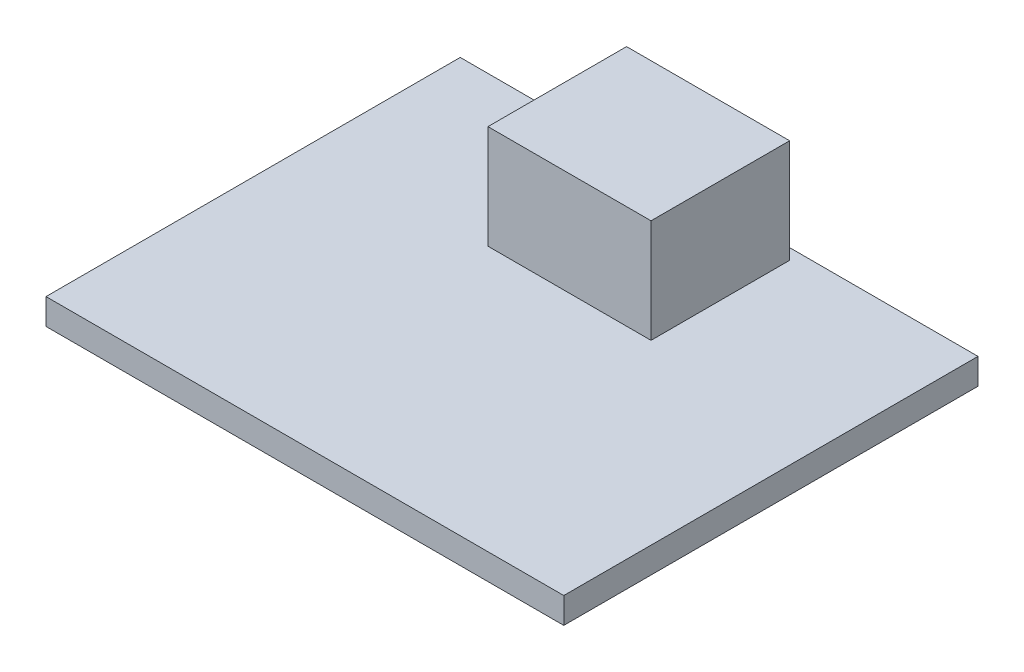
ISO-10303-21;
HEADER;
FILE_DESCRIPTION(('STEP AP214'),'2;1');
FILE_NAME('part.step','',(''),(''),'','','');
FILE_SCHEMA(('AUTOMOTIVE_DESIGN { 1 0 10303 214 1 1 1 1 }'));
ENDSEC;
DATA;
#1=APPLICATION_CONTEXT('core data for automotive mechanical design processes');
#2=APPLICATION_PROTOCOL_DEFINITION('international standard','automotive_design',2000,#1);
#3=PRODUCT_CONTEXT('',#1,'mechanical');
#4=PRODUCT('Part','Part','',(#3));
#5=PRODUCT_RELATED_PRODUCT_CATEGORY('part','',(#4));
#6=PRODUCT_DEFINITION_FORMATION('','',#4);
#7=PRODUCT_DEFINITION_CONTEXT('part definition',#1,'design');
#8=PRODUCT_DEFINITION('design','',#6,#7);
#9=PRODUCT_DEFINITION_SHAPE('','',#8);
#10=(LENGTH_UNIT() NAMED_UNIT(*) SI_UNIT(.MILLI.,.METRE.));
#11=(NAMED_UNIT(*) PLANE_ANGLE_UNIT() SI_UNIT($,.RADIAN.));
#12=(NAMED_UNIT(*) SI_UNIT($,.STERADIAN.) SOLID_ANGLE_UNIT());
#13=UNCERTAINTY_MEASURE_WITH_UNIT(LENGTH_MEASURE(1.E-05),#10,'distance_accuracy_value','');
#14=(GEOMETRIC_REPRESENTATION_CONTEXT(3) GLOBAL_UNCERTAINTY_ASSIGNED_CONTEXT((#13)) GLOBAL_UNIT_ASSIGNED_CONTEXT((#10,
#11,#12)) REPRESENTATION_CONTEXT('',''));
#15=CARTESIAN_POINT('',(0.,0.,0.));
#16=DIRECTION('',(0.,0.,1.));
#17=DIRECTION('',(1.,0.,0.));
#18=AXIS2_PLACEMENT_3D('',#15,#16,#17);
#19=CARTESIAN_POINT('',(0.,6.35,0.));
#20=DIRECTION('',(0.,-1.,0.));
#21=DIRECTION('',(0.,0.,-1.));
#22=AXIS2_PLACEMENT_3D('',#19,#20,#21);
#23=PLANE('',#22);
#24=DIRECTION('',(0.,0.,-1.));
#25=VECTOR('',#24,1.);
#26=CARTESIAN_POINT('',(63.5,6.35,50.8));
#27=LINE('',#26,#25);
#28=CARTESIAN_POINT('',(63.5,6.35,50.8));
#29=VERTEX_POINT('',#28);
#30=CARTESIAN_POINT('',(63.5,6.35,-50.8));
#31=VERTEX_POINT('',#30);
#32=EDGE_CURVE('E143',#29,#31,#27,.T.);
#33=ORIENTED_EDGE('',*,*,#32,.T.);
#34=DIRECTION('',(-1.,0.,0.));
#35=VECTOR('',#34,1.);
#36=CARTESIAN_POINT('',(-63.5,6.35,-50.8));
#37=LINE('',#36,#35);
#38=CARTESIAN_POINT('',(-63.5,6.35,-50.8));
#39=VERTEX_POINT('',#38);
#40=EDGE_CURVE('E87',#31,#39,#37,.T.);
#41=ORIENTED_EDGE('',*,*,#40,.T.);
#42=DIRECTION('',(0.,0.,1.));
#43=VECTOR('',#42,1.);
#44=CARTESIAN_POINT('',(-63.5,6.35,50.8));
#45=LINE('',#44,#43);
#46=CARTESIAN_POINT('',(-63.5,6.35,50.8));
#47=VERTEX_POINT('',#46);
#48=EDGE_CURVE('E146',#39,#47,#45,.T.);
#49=ORIENTED_EDGE('',*,*,#48,.T.);
#50=DIRECTION('',(1.,0.,0.));
#51=VECTOR('',#50,1.);
#52=CARTESIAN_POINT('',(-63.5,6.35,50.8));
#53=LINE('',#52,#51);
#54=EDGE_CURVE('E59',#47,#29,#53,.T.);
#55=ORIENTED_EDGE('',*,*,#54,.T.);
#56=EDGE_LOOP('',(#33,#41,#49,#55));
#57=FACE_BOUND('',#56,.T.);
#58=DIRECTION('',(1.,0.,0.));
#59=VECTOR('',#58,1.);
#60=CARTESIAN_POINT('',(0.,6.35,-14.1));
#61=LINE('',#60,#59);
#62=CARTESIAN_POINT('',(-20.,6.35,-14.1));
#63=VERTEX_POINT('',#62);
#64=CARTESIAN_POINT('',(20.,6.35,-14.1));
#65=VERTEX_POINT('',#64);
#66=EDGE_CURVE('E132',#63,#65,#61,.T.);
#67=ORIENTED_EDGE('',*,*,#66,.F.);
#68=DIRECTION('',(0.,0.,-1.));
#69=VECTOR('',#68,1.);
#70=CARTESIAN_POINT('',(-20.,6.35,0.));
#71=LINE('',#70,#69);
#72=CARTESIAN_POINT('',(-20.,6.35,-48.1));
#73=VERTEX_POINT('',#72);
#74=EDGE_CURVE('E128',#63,#73,#71,.T.);
#75=ORIENTED_EDGE('',*,*,#74,.T.);
#76=DIRECTION('',(1.,0.,0.));
#77=VECTOR('',#76,1.);
#78=CARTESIAN_POINT('',(0.,6.35,-48.1));
#79=LINE('',#78,#77);
#80=CARTESIAN_POINT('',(20.,6.35,-48.1));
#81=VERTEX_POINT('',#80);
#82=EDGE_CURVE('E50',#73,#81,#79,.T.);
#83=ORIENTED_EDGE('',*,*,#82,.T.);
#84=DIRECTION('',(0.,0.,-1.));
#85=VECTOR('',#84,1.);
#86=CARTESIAN_POINT('',(20.,6.35,0.));
#87=LINE('',#86,#85);
#88=EDGE_CURVE('E264',#65,#81,#87,.T.);
#89=ORIENTED_EDGE('',*,*,#88,.F.);
#90=EDGE_LOOP('',(#67,#75,#83,#89));
#91=FACE_BOUND('',#90,.T.);
#92=ADVANCED_FACE('F35',(#57,#91),#23,.F.);
#93=CARTESIAN_POINT('',(63.5,6.35,50.8));
#94=DIRECTION('',(-1.,0.,0.));
#95=DIRECTION('',(0.,0.,1.));
#96=AXIS2_PLACEMENT_3D('',#93,#94,#95);
#97=PLANE('',#96);
#98=DIRECTION('',(0.,0.,-1.));
#99=VECTOR('',#98,1.);
#100=CARTESIAN_POINT('',(63.5,0.,50.8));
#101=LINE('',#100,#99);
#102=CARTESIAN_POINT('',(63.5,0.,50.8));
#103=VERTEX_POINT('',#102);
#104=CARTESIAN_POINT('',(63.5,0.,-50.8));
#105=VERTEX_POINT('',#104);
#106=EDGE_CURVE('E134',#103,#105,#101,.T.);
#107=ORIENTED_EDGE('',*,*,#106,.T.);
#108=DIRECTION('',(0.,-1.,0.));
#109=VECTOR('',#108,1.);
#110=CARTESIAN_POINT('',(63.5,6.35,-50.8));
#111=LINE('',#110,#109);
#112=EDGE_CURVE('E11',#31,#105,#111,.T.);
#113=ORIENTED_EDGE('',*,*,#112,.F.);
#114=ORIENTED_EDGE('',*,*,#32,.F.);
#115=DIRECTION('',(0.,-1.,0.));
#116=VECTOR('',#115,1.);
#117=CARTESIAN_POINT('',(63.5,6.35,50.8));
#118=LINE('',#117,#116);
#119=EDGE_CURVE('E148',#29,#103,#118,.T.);
#120=ORIENTED_EDGE('',*,*,#119,.T.);
#121=EDGE_LOOP('',(#107,#113,#114,#120));
#122=FACE_BOUND('',#121,.T.);
#123=ADVANCED_FACE('F37',(#122),#97,.F.);
#124=CARTESIAN_POINT('',(-63.5,6.35,-50.8));
#125=DIRECTION('',(0.,0.,1.));
#126=DIRECTION('',(1.,0.,0.));
#127=AXIS2_PLACEMENT_3D('',#124,#125,#126);
#128=PLANE('',#127);
#129=DIRECTION('',(-1.,0.,0.));
#130=VECTOR('',#129,1.);
#131=CARTESIAN_POINT('',(-63.5,0.,-50.8));
#132=LINE('',#131,#130);
#133=CARTESIAN_POINT('',(-63.5,0.,-50.8));
#134=VERTEX_POINT('',#133);
#135=EDGE_CURVE('E137',#105,#134,#132,.T.);
#136=ORIENTED_EDGE('',*,*,#135,.T.);
#137=DIRECTION('',(0.,-1.,0.));
#138=VECTOR('',#137,1.);
#139=CARTESIAN_POINT('',(-63.5,6.35,-50.8));
#140=LINE('',#139,#138);
#141=EDGE_CURVE('E43',#39,#134,#140,.T.);
#142=ORIENTED_EDGE('',*,*,#141,.F.);
#143=ORIENTED_EDGE('',*,*,#40,.F.);
#144=ORIENTED_EDGE('',*,*,#112,.T.);
#145=EDGE_LOOP('',(#136,#142,#143,#144));
#146=FACE_BOUND('',#145,.T.);
#147=ADVANCED_FACE('F176',(#146),#128,.F.);
#148=CARTESIAN_POINT('',(-63.5,6.35,50.8));
#149=DIRECTION('',(1.,0.,0.));
#150=DIRECTION('',(0.,0.,-1.));
#151=AXIS2_PLACEMENT_3D('',#148,#149,#150);
#152=PLANE('',#151);
#153=DIRECTION('',(0.,0.,1.));
#154=VECTOR('',#153,1.);
#155=CARTESIAN_POINT('',(-63.5,0.,50.8));
#156=LINE('',#155,#154);
#157=CARTESIAN_POINT('',(-63.5,0.,50.8));
#158=VERTEX_POINT('',#157);
#159=EDGE_CURVE('E151',#134,#158,#156,.T.);
#160=ORIENTED_EDGE('',*,*,#159,.T.);
#161=DIRECTION('',(0.,-1.,0.));
#162=VECTOR('',#161,1.);
#163=CARTESIAN_POINT('',(-63.5,6.35,50.8));
#164=LINE('',#163,#162);
#165=EDGE_CURVE('E155',#47,#158,#164,.T.);
#166=ORIENTED_EDGE('',*,*,#165,.F.);
#167=ORIENTED_EDGE('',*,*,#48,.F.);
#168=ORIENTED_EDGE('',*,*,#141,.T.);
#169=EDGE_LOOP('',(#160,#166,#167,#168));
#170=FACE_BOUND('',#169,.T.);
#171=ADVANCED_FACE('F160',(#170),#152,.F.);
#172=CARTESIAN_POINT('',(-63.5,6.35,50.8));
#173=DIRECTION('',(0.,0.,-1.));
#174=DIRECTION('',(-1.,0.,0.));
#175=AXIS2_PLACEMENT_3D('',#172,#173,#174);
#176=PLANE('',#175);
#177=DIRECTION('',(1.,0.,0.));
#178=VECTOR('',#177,1.);
#179=CARTESIAN_POINT('',(-63.5,0.,50.8));
#180=LINE('',#179,#178);
#181=EDGE_CURVE('E80',#158,#103,#180,.T.);
#182=ORIENTED_EDGE('',*,*,#181,.T.);
#183=ORIENTED_EDGE('',*,*,#119,.F.);
#184=ORIENTED_EDGE('',*,*,#54,.F.);
#185=ORIENTED_EDGE('',*,*,#165,.T.);
#186=EDGE_LOOP('',(#182,#183,#184,#185));
#187=FACE_BOUND('',#186,.T.);
#188=ADVANCED_FACE('F168',(#187),#176,.F.);
#189=CARTESIAN_POINT('',(0.,0.,0.));
#190=DIRECTION('',(0.,-1.,0.));
#191=DIRECTION('',(0.,0.,-1.));
#192=AXIS2_PLACEMENT_3D('',#189,#190,#191);
#193=PLANE('',#192);
#194=ORIENTED_EDGE('',*,*,#106,.F.);
#195=ORIENTED_EDGE('',*,*,#181,.F.);
#196=ORIENTED_EDGE('',*,*,#159,.F.);
#197=ORIENTED_EDGE('',*,*,#135,.F.);
#198=EDGE_LOOP('',(#194,#195,#196,#197));
#199=FACE_BOUND('',#198,.T.);
#200=ADVANCED_FACE('F164',(#199),#193,.T.);
#201=CARTESIAN_POINT('',(0.,31.75,-14.1));
#202=DIRECTION('',(0.,0.,-1.));
#203=DIRECTION('',(-1.,0.,0.));
#204=AXIS2_PLACEMENT_3D('',#201,#202,#203);
#205=PLANE('',#204);
#206=ORIENTED_EDGE('',*,*,#66,.T.);
#207=DIRECTION('',(0.,-1.,0.));
#208=VECTOR('',#207,1.);
#209=CARTESIAN_POINT('',(20.,31.75,-14.1));
#210=LINE('',#209,#208);
#211=CARTESIAN_POINT('',(20.,31.75,-14.1));
#212=VERTEX_POINT('',#211);
#213=EDGE_CURVE('E113',#212,#65,#210,.T.);
#214=ORIENTED_EDGE('',*,*,#213,.F.);
#215=DIRECTION('',(1.,0.,0.));
#216=VECTOR('',#215,1.);
#217=CARTESIAN_POINT('',(0.,31.75,-14.1));
#218=LINE('',#217,#216);
#219=CARTESIAN_POINT('',(-20.,31.75,-14.1));
#220=VERTEX_POINT('',#219);
#221=EDGE_CURVE('E120',#220,#212,#218,.T.);
#222=ORIENTED_EDGE('',*,*,#221,.F.);
#223=DIRECTION('',(0.,-1.,0.));
#224=VECTOR('',#223,1.);
#225=CARTESIAN_POINT('',(-20.,31.75,-14.1));
#226=LINE('',#225,#224);
#227=EDGE_CURVE('E262',#220,#63,#226,.T.);
#228=ORIENTED_EDGE('',*,*,#227,.T.);
#229=EDGE_LOOP('',(#206,#214,#222,#228));
#230=FACE_BOUND('',#229,.T.);
#231=ADVANCED_FACE('F130',(#230),#205,.F.);
#232=CARTESIAN_POINT('',(20.,31.75,0.));
#233=DIRECTION('',(-1.,0.,0.));
#234=DIRECTION('',(0.,0.,1.));
#235=AXIS2_PLACEMENT_3D('',#232,#233,#234);
#236=PLANE('',#235);
#237=ORIENTED_EDGE('',*,*,#88,.T.);
#238=DIRECTION('',(0.,-1.,0.));
#239=VECTOR('',#238,1.);
#240=CARTESIAN_POINT('',(20.,31.75,-48.1));
#241=LINE('',#240,#239);
#242=CARTESIAN_POINT('',(20.,31.75,-48.1));
#243=VERTEX_POINT('',#242);
#244=EDGE_CURVE('E115',#243,#81,#241,.T.);
#245=ORIENTED_EDGE('',*,*,#244,.F.);
#246=DIRECTION('',(0.,0.,-1.));
#247=VECTOR('',#246,1.);
#248=CARTESIAN_POINT('',(20.,31.75,0.));
#249=LINE('',#248,#247);
#250=EDGE_CURVE('E108',#212,#243,#249,.T.);
#251=ORIENTED_EDGE('',*,*,#250,.F.);
#252=ORIENTED_EDGE('',*,*,#213,.T.);
#253=EDGE_LOOP('',(#237,#245,#251,#252));
#254=FACE_BOUND('',#253,.T.);
#255=ADVANCED_FACE('F111',(#254),#236,.F.);
#256=CARTESIAN_POINT('',(0.,31.75,-48.1));
#257=DIRECTION('',(0.,0.,-1.));
#258=DIRECTION('',(-1.,0.,0.));
#259=AXIS2_PLACEMENT_3D('',#256,#257,#258);
#260=PLANE('',#259);
#261=ORIENTED_EDGE('',*,*,#82,.F.);
#262=DIRECTION('',(0.,-1.,0.));
#263=VECTOR('',#262,1.);
#264=CARTESIAN_POINT('',(-20.,31.75,-48.1));
#265=LINE('',#264,#263);
#266=CARTESIAN_POINT('',(-20.,31.75,-48.1));
#267=VERTEX_POINT('',#266);
#268=EDGE_CURVE('E139',#267,#73,#265,.T.);
#269=ORIENTED_EDGE('',*,*,#268,.F.);
#270=DIRECTION('',(1.,0.,0.));
#271=VECTOR('',#270,1.);
#272=CARTESIAN_POINT('',(0.,31.75,-48.1));
#273=LINE('',#272,#271);
#274=EDGE_CURVE('E119',#267,#243,#273,.T.);
#275=ORIENTED_EDGE('',*,*,#274,.T.);
#276=ORIENTED_EDGE('',*,*,#244,.T.);
#277=EDGE_LOOP('',(#261,#269,#275,#276));
#278=FACE_BOUND('',#277,.T.);
#279=ADVANCED_FACE('F189',(#278),#260,.T.);
#280=CARTESIAN_POINT('',(-20.,31.75,0.));
#281=DIRECTION('',(-1.,0.,0.));
#282=DIRECTION('',(0.,0.,1.));
#283=AXIS2_PLACEMENT_3D('',#280,#281,#282);
#284=PLANE('',#283);
#285=ORIENTED_EDGE('',*,*,#74,.F.);
#286=ORIENTED_EDGE('',*,*,#227,.F.);
#287=DIRECTION('',(0.,0.,-1.));
#288=VECTOR('',#287,1.);
#289=CARTESIAN_POINT('',(-20.,31.75,0.));
#290=LINE('',#289,#288);
#291=EDGE_CURVE('E126',#220,#267,#290,.T.);
#292=ORIENTED_EDGE('',*,*,#291,.T.);
#293=ORIENTED_EDGE('',*,*,#268,.T.);
#294=EDGE_LOOP('',(#285,#286,#292,#293));
#295=FACE_BOUND('',#294,.T.);
#296=ADVANCED_FACE('F192',(#295),#284,.T.);
#297=CARTESIAN_POINT('',(0.,31.75,0.));
#298=DIRECTION('',(0.,1.,0.));
#299=DIRECTION('',(0.,0.,1.));
#300=AXIS2_PLACEMENT_3D('',#297,#298,#299);
#301=PLANE('',#300);
#302=ORIENTED_EDGE('',*,*,#221,.T.);
#303=ORIENTED_EDGE('',*,*,#250,.T.);
#304=ORIENTED_EDGE('',*,*,#274,.F.);
#305=ORIENTED_EDGE('',*,*,#291,.F.);
#306=EDGE_LOOP('',(#302,#303,#304,#305));
#307=FACE_BOUND('',#306,.T.);
#308=ADVANCED_FACE('F124',(#307),#301,.T.);
#309=CLOSED_SHELL('',(#92,#123,#147,#171,#188,#200,#231,#255,#279,#296,#308));
#310=MANIFOLD_SOLID_BREP('B2',#309);
#311=ADVANCED_BREP_SHAPE_REPRESENTATION('',(#18,#310),#14);
#312=SHAPE_DEFINITION_REPRESENTATION(#9,#311);
ENDSEC;
END-ISO-10303-21;
